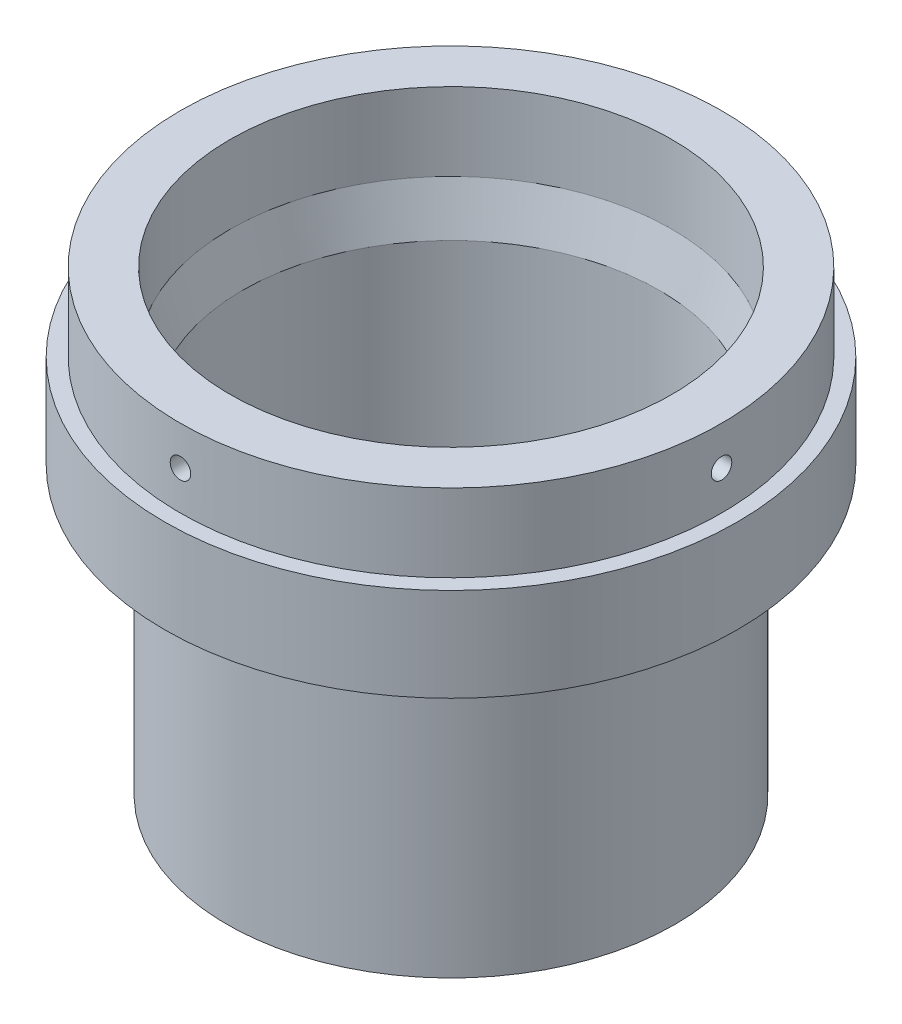
ISO-10303-21;
HEADER;
FILE_DESCRIPTION(('STEP AP214'),'2;1');
FILE_NAME('part.step','',(''),(''),'','','');
FILE_SCHEMA(('AUTOMOTIVE_DESIGN { 1 0 10303 214 1 1 1 1 }'));
ENDSEC;
DATA;
#1=APPLICATION_CONTEXT('core data for automotive mechanical design processes');
#2=APPLICATION_PROTOCOL_DEFINITION('international standard','automotive_design',2000,#1);
#3=PRODUCT_CONTEXT('',#1,'mechanical');
#4=PRODUCT('Part','Part','',(#3));
#5=PRODUCT_RELATED_PRODUCT_CATEGORY('part','',(#4));
#6=PRODUCT_DEFINITION_FORMATION('','',#4);
#7=PRODUCT_DEFINITION_CONTEXT('part definition',#1,'design');
#8=PRODUCT_DEFINITION('design','',#6,#7);
#9=PRODUCT_DEFINITION_SHAPE('','',#8);
#10=(LENGTH_UNIT() NAMED_UNIT(*) SI_UNIT(.MILLI.,.METRE.));
#11=(NAMED_UNIT(*) PLANE_ANGLE_UNIT() SI_UNIT($,.RADIAN.));
#12=(NAMED_UNIT(*) SI_UNIT($,.STERADIAN.) SOLID_ANGLE_UNIT());
#13=UNCERTAINTY_MEASURE_WITH_UNIT(LENGTH_MEASURE(1.E-05),#10,'distance_accuracy_value','');
#14=(GEOMETRIC_REPRESENTATION_CONTEXT(3) GLOBAL_UNCERTAINTY_ASSIGNED_CONTEXT((#13)) GLOBAL_UNIT_ASSIGNED_CONTEXT((#10,
#11,#12)) REPRESENTATION_CONTEXT('',''));
#15=CARTESIAN_POINT('',(0.,0.,0.));
#16=DIRECTION('',(0.,0.,1.));
#17=DIRECTION('',(1.,0.,0.));
#18=AXIS2_PLACEMENT_3D('',#15,#16,#17);
#19=CARTESIAN_POINT('',(1.3720995995543E-13,-14.9999999999998,0.));
#20=DIRECTION('',(0.,1.,0.));
#21=DIRECTION('',(-1.,0.,0.));
#22=AXIS2_PLACEMENT_3D('',#19,#20,#21);
#23=CONICAL_SURFACE('',#22,67.0000000000001,0.260602391747339);
#24=CARTESIAN_POINT('',(0.,2.32452945780892E-13,0.));
#25=DIRECTION('',(0.,1.,0.));
#26=DIRECTION('',(-1.,0.,0.));
#27=AXIS2_PLACEMENT_3D('',#24,#25,#26);
#28=CIRCLE('',#27,71.0000000000001);
#29=CARTESIAN_POINT('',(-71.,0.,0.));
#30=VERTEX_POINT('',#29);
#31=EDGE_CURVE('E114',#30,#30,#28,.T.);
#32=ORIENTED_EDGE('',*,*,#31,.T.);
#33=EDGE_LOOP('',(#32));
#34=FACE_BOUND('',#33,.T.);
#35=CARTESIAN_POINT('',(1.3720995995543E-13,-14.9999999999998,0.));
#36=DIRECTION('',(0.,1.,0.));
#37=DIRECTION('',(-1.,0.,0.));
#38=AXIS2_PLACEMENT_3D('',#35,#36,#37);
#39=CIRCLE('',#38,67.0000000000001);
#40=CARTESIAN_POINT('',(-67.,-15.,0.));
#41=VERTEX_POINT('',#40);
#42=EDGE_CURVE('E87',#41,#41,#39,.T.);
#43=ORIENTED_EDGE('',*,*,#42,.F.);
#44=EDGE_LOOP('',(#43));
#45=FACE_BOUND('',#44,.T.);
#46=ADVANCED_FACE('F41',(#34,#45),#23,.F.);
#47=CARTESIAN_POINT('',(0.,25.,0.));
#48=DIRECTION('',(0.,1.,0.));
#49=DIRECTION('',(-1.,0.,0.));
#50=AXIS2_PLACEMENT_3D('',#47,#48,#49);
#51=CYLINDRICAL_SURFACE('',#50,71.);
#52=CARTESIAN_POINT('',(0.,25.0000000000002,0.));
#53=DIRECTION('',(0.,1.,0.));
#54=DIRECTION('',(-1.,0.,0.));
#55=AXIS2_PLACEMENT_3D('',#52,#53,#54);
#56=CIRCLE('',#55,71.);
#57=CARTESIAN_POINT('',(-71.,25.,0.));
#58=VERTEX_POINT('',#57);
#59=EDGE_CURVE('E111',#58,#58,#56,.T.);
#60=ORIENTED_EDGE('',*,*,#59,.T.);
#61=EDGE_LOOP('',(#60));
#62=FACE_BOUND('',#61,.T.);
#63=ORIENTED_EDGE('',*,*,#31,.F.);
#64=EDGE_LOOP('',(#63));
#65=FACE_BOUND('',#64,.T.);
#66=ADVANCED_FACE('F172',(#62,#65),#51,.F.);
#67=CARTESIAN_POINT('',(-71.,25.,0.));
#68=DIRECTION('',(0.,1.,0.));
#69=DIRECTION('',(-1.,0.,0.));
#70=AXIS2_PLACEMENT_3D('',#67,#68,#69);
#71=PLANE('',#70);
#72=CARTESIAN_POINT('',(0.,25.0000000000003,0.));
#73=DIRECTION('',(0.,1.,0.));
#74=DIRECTION('',(-1.,0.,0.));
#75=AXIS2_PLACEMENT_3D('',#72,#73,#74);
#76=CIRCLE('',#75,87.);
#77=CARTESIAN_POINT('',(-87.,25.,0.));
#78=VERTEX_POINT('',#77);
#79=EDGE_CURVE('E108',#78,#78,#76,.T.);
#80=ORIENTED_EDGE('',*,*,#79,.T.);
#81=EDGE_LOOP('',(#80));
#82=FACE_BOUND('',#81,.T.);
#83=ORIENTED_EDGE('',*,*,#59,.F.);
#84=EDGE_LOOP('',(#83));
#85=FACE_BOUND('',#84,.T.);
#86=ADVANCED_FACE('F168',(#82,#85),#71,.T.);
#87=CARTESIAN_POINT('',(0.,25.,0.));
#88=DIRECTION('',(0.,1.,0.));
#89=DIRECTION('',(-1.,0.,0.));
#90=AXIS2_PLACEMENT_3D('',#87,#88,#89);
#91=CYLINDRICAL_SURFACE('',#90,87.);
#92=CARTESIAN_POINT('',(0.,9.20000000000024,87.));
#93=CARTESIAN_POINT('',(0.18529095244278,9.20000819478928,86.9999991587534));
#94=CARTESIAN_POINT('',(0.370714561009038,9.21565818271023,86.9994017095997));
#95=CARTESIAN_POINT('',(0.736450212431913,9.27786917070662,86.9970758018717));
#96=CARTESIAN_POINT('',(0.916755911366024,9.32446692483459,86.995345998531));
#97=CARTESIAN_POINT('',(1.26690454352066,9.44724060921909,86.9909512407089));
#98=CARTESIAN_POINT('',(1.43675261881341,9.52340186617074,86.9882867502054));
#99=CARTESIAN_POINT('',(1.76120600221916,9.70311905641533,86.9823230108704));
#100=CARTESIAN_POINT('',(1.91581497755396,9.80666837669051,86.9790239153205));
#101=CARTESIAN_POINT('',(2.20554780029224,10.0382982711597,86.9721599521716));
#102=CARTESIAN_POINT('',(2.34066081631659,10.1663923904301,86.9685949384919));
#103=CARTESIAN_POINT('',(2.58747461819329,10.4434503072389,86.9616022130806));
#104=CARTESIAN_POINT('',(2.69917446366357,10.5924149426339,86.9581745068684));
#105=CARTESIAN_POINT('',(2.89601498552485,10.9070343820858,86.9518420391884));
#106=CARTESIAN_POINT('',(2.98114812305411,11.0726939060574,86.948937426258));
#107=CARTESIAN_POINT('',(3.12238996345476,11.4159672425502,86.9439802641016));
#108=CARTESIAN_POINT('',(3.17849881763166,11.5935809927478,86.9419277104338));
#109=CARTESIAN_POINT('',(3.26007324948928,11.9556296550012,86.9389073166602));
#110=CARTESIAN_POINT('',(3.28555369069886,12.1400612136448,86.9379389504295));
#111=CARTESIAN_POINT('',(3.30519382491087,12.5105862631623,86.9371945426646));
#112=CARTESIAN_POINT('',(3.29935368404355,12.6966797452159,86.9374184948061));
#113=CARTESIAN_POINT('',(3.25653089995661,13.0651452544672,86.9390329796004));
#114=CARTESIAN_POINT('',(3.21956431173397,13.247519150564,86.9404229108407));
#115=CARTESIAN_POINT('',(3.11556283410838,13.6034708672346,86.9442117297576));
#116=CARTESIAN_POINT('',(3.04852785796583,13.7770486624324,86.9466106203448));
#117=CARTESIAN_POINT('',(2.88627407902864,14.1105326733961,86.9521476442038));
#118=CARTESIAN_POINT('',(2.79104792995578,14.2704353115656,86.95528597012));
#119=CARTESIAN_POINT('',(2.57512033053932,14.5719907710078,86.961947903449));
#120=CARTESIAN_POINT('',(2.45441878101902,14.7136435212297,86.9654715123618));
#121=CARTESIAN_POINT('',(2.19087591450724,14.9747716913061,86.9725094956572));
#122=CARTESIAN_POINT('',(2.0480206844283,15.0942330700634,86.9760238628155));
#123=CARTESIAN_POINT('',(1.74427460493382,15.3074792916116,86.9826450687882));
#124=CARTESIAN_POINT('',(1.58338375215743,15.4012641296177,86.9857519075268));
#125=CARTESIAN_POINT('',(1.24812558181971,15.5604935718993,86.9912079316731));
#126=CARTESIAN_POINT('',(1.07375804650905,15.6259377181474,86.9935571048358));
#127=CARTESIAN_POINT('',(0.716499723649196,15.7266190203942,86.997232815552));
#128=CARTESIAN_POINT('',(0.53360897297178,15.7618563070561,86.9985593575291));
#129=CARTESIAN_POINT('',(0.164617792524057,15.8011063926072,87.000039715589));
#130=CARTESIAN_POINT('',(-0.0214805680280341,15.805138618003,87.0001942612892));
#131=CARTESIAN_POINT('',(-0.391711471530855,15.7819147701557,86.9993151412912));
#132=CARTESIAN_POINT('',(-0.575844018178959,15.754658755771,86.9982814778284));
#133=CARTESIAN_POINT('',(-0.936862192099431,15.6696482048391,86.9951428804304));
#134=CARTESIAN_POINT('',(-1.11374990328072,15.6119025057017,86.9930382569186));
#135=CARTESIAN_POINT('',(-1.45532127024603,15.4675607358494,86.9879948280514));
#136=CARTESIAN_POINT('',(-1.62000488602544,15.3809645705689,86.9850560199618));
#137=CARTESIAN_POINT('',(-1.93258264558572,15.181330085297,86.9786733085207));
#138=CARTESIAN_POINT('',(-2.08046844490739,15.0682787080445,86.9752291560651));
#139=CARTESIAN_POINT('',(-2.35516879815266,14.8189620521393,86.9682246508299));
#140=CARTESIAN_POINT('',(-2.48198327094768,14.6826966841124,86.9646642976029));
#141=CARTESIAN_POINT('',(-2.71100623408401,14.3907367582438,86.9578266575501));
#142=CARTESIAN_POINT('',(-2.81320217909262,14.2350323555817,86.9545495155887));
#143=CARTESIAN_POINT('',(-2.99000138206169,13.9086642627058,86.9486500767933));
#144=CARTESIAN_POINT('',(-3.06460472179559,13.7380006168271,86.9460277780185));
#145=CARTESIAN_POINT('',(-3.18407903769409,13.3866055293846,86.9417347334941));
#146=CARTESIAN_POINT('',(-3.22895809008433,13.2058768370199,86.9400637292907));
#147=CARTESIAN_POINT('',(-3.28773632939187,12.8394431346609,86.9378609589733));
#148=CARTESIAN_POINT('',(-3.30163559349013,12.6537381370653,86.9373291900211));
#149=CARTESIAN_POINT('',(-3.29805879832098,12.2827484932855,86.9374649405143));
#150=CARTESIAN_POINT('',(-3.28060249782986,12.097463655999,86.9381317047016));
#151=CARTESIAN_POINT('',(-3.21485082014749,11.7324567766207,86.9405877702232));
#152=CARTESIAN_POINT('',(-3.16655538250463,11.552734745434,86.942377073758));
#153=CARTESIAN_POINT('',(-3.04049979189249,11.2039493913785,86.9468763781481));
#154=CARTESIAN_POINT('',(-2.96273921466861,11.0348862220225,86.9495863922602));
#155=CARTESIAN_POINT('',(-2.77996551115142,10.7122162339215,86.9556215300228));
#156=CARTESIAN_POINT('',(-2.67495331996582,10.5586088850787,86.9589466325662));
#157=CARTESIAN_POINT('',(-2.44059171131458,10.271115459261,86.9658394072512));
#158=CARTESIAN_POINT('',(-2.31122959583752,10.1372397371864,86.969407205331));
#159=CARTESIAN_POINT('',(-2.03182847359415,9.89306745491063,86.9763827597774));
#160=CARTESIAN_POINT('',(-1.88178436618135,9.78277672847471,86.9797904763855));
#161=CARTESIAN_POINT('',(-1.56520002268874,9.58887549751029,86.9860633530731));
#162=CARTESIAN_POINT('',(-1.39864747110511,9.50528511106686,86.9889281033824));
#163=CARTESIAN_POINT('',(-1.05398856671781,9.36735194852884,86.9937853389758));
#164=CARTESIAN_POINT('',(-0.875896231430999,9.31297440681631,86.9957788605621));
#165=CARTESIAN_POINT('',(-0.580570879763768,9.24937159597079,86.9981380657912));
#166=CARTESIAN_POINT('',(-0.465253454743875,9.23088065796591,86.9988332484629));
#167=CARTESIAN_POINT('',(-0.233308220571082,9.20619228272759,86.9997644803302));
#168=CARTESIAN_POINT('',(-0.116680412044109,9.1999948396222,87.0000005297452));
#169=CARTESIAN_POINT('',(0.,9.20000000000024,87.));
#170=B_SPLINE_CURVE_WITH_KNOTS('',3,(#92,#93,#94,#95,#96,#97,#98,#99,#100,#101,#102,#103,#104,
#105,#106,#107,#108,#109,#110,#111,#112,#113,#114,#115,#116,#117,#118,#119,#120,#121,#122,#123,
#124,#125,#126,#127,#128,#129,#130,#131,#132,#133,#134,#135,#136,#137,#138,#139,#140,#141,#142,
#143,#144,#145,#146,#147,#148,#149,#150,#151,#152,#153,#154,#155,#156,#157,#158,#159,#160,#161,
#162,#163,#164,#165,#166,#167,#168,#169),.UNSPECIFIED.,.T.,.F.,(4,2,2,2,2,2,2,2,2,2,2,2,2,2,2,2,
2,2,2,2,2,2,2,2,2,2,2,2,2,2,2,2,2,2,2,2,2,2,4),(0.,0.555446949206098,1.11155473833374,
1.6673868657119,2.22308490630164,2.77909049732939,3.33511841585613,3.89130397581148,
4.44748663630541,5.00339928023491,5.55930897550192,6.11493210851098,6.6705568443611,
7.22632649692753,7.78209831316598,8.33822059273788,8.89434297594115,9.45047434656434,
10.0066033115639,10.5623860342402,11.118167711396,11.6737883840563,12.2294108779418,
12.7853081859879,13.3412076342937,13.897389766457,14.4535702503061,15.0095995552982,
15.5656274750349,16.1213051354973,16.6769838852158,17.2326706361939,17.7883383219429,
18.3442965844142,18.9003922048961,19.4569058474721,20.0127557189231,20.3625289215749,
20.7123019571583),.UNSPECIFIED.);
#171=CARTESIAN_POINT('',(0.,9.20000000000024,87.));
#172=VERTEX_POINT('',#171);
#173=EDGE_CURVE('E11',#172,#172,#170,.T.);
#174=ORIENTED_EDGE('',*,*,#173,.F.);
#175=EDGE_LOOP('',(#174));
#176=FACE_BOUND('',#175,.T.);
#177=CARTESIAN_POINT('',(86.9373912652089,12.5000000000005,-3.29999999999999));
#178=CARTESIAN_POINT('',(86.9373921087452,12.6852908983684,-3.29999180516183));
#179=CARTESIAN_POINT('',(86.9379899993724,12.8707144530457,-3.28434182606637));
#180=CARTESIAN_POINT('',(86.9403174837961,13.2364499924961,-3.22213087631443));
#181=CARTESIAN_POINT('',(86.9420484231914,13.4167556333046,-3.17553315142281));
#182=CARTESIAN_POINT('',(86.9464456470428,13.766904142597,-3.05275955257967));
#183=CARTESIAN_POINT('',(86.9491114673799,13.9367521536457,-2.9765983533286));
#184=CARTESIAN_POINT('',(86.955077477937,14.2612054295914,-2.79688129892739));
#185=CARTESIAN_POINT('',(86.9583775149721,14.4158143616287,-2.69333205665157));
#186=CARTESIAN_POINT('',(86.9652425639384,14.705547234007,-2.4617022406606));
#187=CARTESIAN_POINT('',(86.9688077216945,14.8406603290756,-2.33360810447443));
#188=CARTESIAN_POINT('',(86.9757998716075,15.0874742832952,-2.05655012074578));
#189=CARTESIAN_POINT('',(86.9792268582118,15.1991742023062,-1.9075854355613));
#190=CARTESIAN_POINT('',(86.9855573366221,15.3960148004862,-1.59296595323046));
#191=CARTESIAN_POINT('',(86.988460680005,15.4811479544628,-1.42730644472432));
#192=CARTESIAN_POINT('',(86.9934153113979,15.6223898295488,-1.08403314186275));
#193=CARTESIAN_POINT('',(86.9954666038439,15.6784987017637,-0.906419409748537));
#194=CARTESIAN_POINT('',(86.9984850375646,15.7600731721785,-0.544370799839319));
#195=CARTESIAN_POINT('',(86.9994527047368,15.7855536351889,-0.359939275741994));
#196=CARTESIAN_POINT('',(87.0001965825069,15.8051938249689,0.0105857063585238));
#197=CARTESIAN_POINT('',(86.9999727994157,15.7993537176395,0.196679155553507));
#198=CARTESIAN_POINT('',(86.9983594461477,15.7565309860194,0.565144814406469));
#199=CARTESIAN_POINT('',(86.9969704757108,15.7195643829826,0.747518889028117));
#200=CARTESIAN_POINT('',(86.9931839486161,15.6155628135994,1.10347095512055));
#201=CARTESIAN_POINT('',(86.9907863890598,15.5485277608428,1.27704892131166));
#202=CARTESIAN_POINT('',(86.9852518169959,15.3862738245822,1.61053313709578));
#203=CARTESIAN_POINT('',(86.9821146122635,15.2910476128917,1.77043581790226));
#204=CARTESIAN_POINT('',(86.9754542187165,15.0751198805294,2.07199133593742));
#205=CARTESIAN_POINT('',(86.9719310283986,14.9544182606407,2.21364410208634));
#206=CARTESIAN_POINT('',(86.9648929989714,14.6908753449858,2.47477219032458));
#207=CARTESIAN_POINT('',(86.961378166521,14.548020150299,2.59423348559051));
#208=CARTESIAN_POINT('',(86.9547553468902,14.2442741710819,2.80747955566132));
#209=CARTESIAN_POINT('',(86.9516473597882,14.0833833830737,2.90126432551469));
#210=CARTESIAN_POINT('',(86.9461888573978,13.7481252286265,3.0604937190454));
#211=CARTESIAN_POINT('',(86.9438383549218,13.5737576342973,3.12593786336458));
#212=CARTESIAN_POINT('',(86.940160389997,13.2164991834045,3.22661914359559));
#213=CARTESIAN_POINT('',(86.9388329231111,13.0336083638109,3.26185641051888));
#214=CARTESIAN_POINT('',(86.9373515267722,12.6646171539529,3.30110642189102));
#215=CARTESIAN_POINT('',(86.937196866491,12.4785188349098,3.30513861164977));
#216=CARTESIAN_POINT('',(86.9380766160446,12.1082880230438,3.28191470735146));
#217=CARTESIAN_POINT('',(86.9391110236428,11.9241555265238,3.25465867214878));
#218=CARTESIAN_POINT('',(86.9422516410433,11.5631375885775,3.16964812961086));
#219=CARTESIAN_POINT('',(86.9443575395311,11.3862500582939,3.11190248065003));
#220=CARTESIAN_POINT('',(86.9494034911316,11.044679030851,2.96756087189965));
#221=CARTESIAN_POINT('',(86.9523435469871,10.8799955738203,2.88096481725154));
#222=CARTESIAN_POINT('',(86.9587281846663,10.5674179183321,2.68133049248357));
#223=CARTESIAN_POINT('',(86.9621730158476,10.4195320823178,2.56827913694813));
#224=CARTESIAN_POINT('',(86.9691780085503,10.1448316448892,2.31896250384218));
#225=CARTESIAN_POINT('',(86.9727381705149,10.0180171244476,2.18269713706913));
#226=CARTESIAN_POINT('',(86.9795746417922,9.78899406416951,1.89073718957618));
#227=CARTESIAN_POINT('',(86.98285080584,9.6867980697265,1.73503276397538));
#228=CARTESIAN_POINT('',(86.9887479303232,9.50999877989488,1.40866461259006));
#229=CARTESIAN_POINT('',(86.9913688927004,9.43539540273225,1.23800093114095));
#230=CARTESIAN_POINT('',(86.9956594914668,9.31592106076201,0.886605870882388));
#231=CARTESIAN_POINT('',(86.9973293867653,9.27104200355003,0.70587724677719));
#232=CARTESIAN_POINT('',(86.9995306542855,9.21226373144893,0.339443687907408));
#233=CARTESIAN_POINT('',(87.0000620293303,9.19836443973973,0.153738765483634));
#234=CARTESIAN_POINT('',(86.9999263793388,9.20194115686155,-0.217250930390027));
#235=CARTESIAN_POINT('',(86.9992601077487,9.21939743971789,-0.402535894619779));
#236=CARTESIAN_POINT('',(86.9968056963572,9.28514912690693,-0.767543032137184));
#237=CARTESIAN_POINT('',(86.9950175543649,9.333444591463,-0.947265194560967));
#238=CARTESIAN_POINT('',(86.9905207335537,9.45950028263822,-1.2960508028094));
#239=CARTESIAN_POINT('',(86.9878120414831,9.5372609334222,-1.46511409515387));
#240=CARTESIAN_POINT('',(86.9817791290937,9.72003482192545,-1.78778429835644));
#241=CARTESIAN_POINT('',(86.9784549298994,9.82504712440463,-1.94139173938761));
#242=CARTESIAN_POINT('',(86.971563151982,10.0594088526925,-2.22888515320914));
#243=CARTESIAN_POINT('',(86.9679954471464,10.1887709512623,-2.36276079167361));
#244=CARTESIAN_POINT('',(86.9610192240854,10.4681720056823,-2.60693291318623));
#245=CARTESIAN_POINT('',(86.9576107454089,10.618216062359,-2.71722356225437));
#246=CARTESIAN_POINT('',(86.9513358207311,10.9348003673608,-2.9111247130945));
#247=CARTESIAN_POINT('',(86.9484697844083,11.1013529402062,-2.99471508203863));
#248=CARTESIAN_POINT('',(86.9436100217506,11.4460118902259,-3.1326482059067));
#249=CARTESIAN_POINT('',(86.9416152590534,11.6241042497665,-3.1870257267278));
#250=CARTESIAN_POINT('',(86.9392545069918,11.9194295452355,-3.25062847669903));
#251=CARTESIAN_POINT('',(86.9385588423169,12.0347468855055,-3.26911938737083));
#252=CARTESIAN_POINT('',(86.937626955942,12.2666919497538,-3.29380772628162));
#253=CARTESIAN_POINT('',(86.9373907340219,12.3833196731047,-3.30000516040671));
#254=CARTESIAN_POINT('',(86.9373912652089,12.5000000000005,-3.29999999999999));
#255=B_SPLINE_CURVE_WITH_KNOTS('',3,(#177,#178,#179,#180,#181,#182,#183,#184,#185,#186,#187,
#188,#189,#190,#191,#192,#193,#194,#195,#196,#197,#198,#199,#200,#201,#202,#203,#204,#205,#206,
#207,#208,#209,#210,#211,#212,#213,#214,#215,#216,#217,#218,#219,#220,#221,#222,#223,#224,#225,
#226,#227,#228,#229,#230,#231,#232,#233,#234,#235,#236,#237,#238,#239,#240,#241,#242,#243,#244,
#245,#246,#247,#248,#249,#250,#251,#252,#253,#254),.UNSPECIFIED.,.T.,.F.,(4,2,2,2,2,2,2,2,2,2,2,
2,2,2,2,2,2,2,2,2,2,2,2,2,2,2,2,2,2,2,2,2,2,2,2,2,2,2,4),(0.,0.555446786810687,1.11155441707581,
1.66738635922061,2.2230842174279,2.77909002087966,3.33511814608765,3.89130362687079,
4.44748621202614,5.0033987573287,5.55930835803927,6.11493199889078,6.67055723649246,
7.22632703380967,7.78209899567343,8.33822106433023,8.89434324023069,9.45047482210908,
10.0066039919547,10.5623865843689,11.118168131336,11.6737882917355,12.2294102790019,
12.7853076730697,13.3412072032862,13.8973894187898,14.4535699859676,15.0095990714576,
15.5656267781686,16.121304807113,16.6769839211998,17.2326710348457,17.7883390805776,
18.3442971253285,18.9003925331219,19.4569062693984,20.0127562291731,20.3625291767923,
20.7123019569406),.UNSPECIFIED.);
#256=CARTESIAN_POINT('',(86.9373912652089,12.5000000000005,-3.29999999999999));
#257=VERTEX_POINT('',#256);
#258=EDGE_CURVE('E53',#257,#257,#255,.T.);
#259=ORIENTED_EDGE('',*,*,#258,.F.);
#260=EDGE_LOOP('',(#259));
#261=FACE_BOUND('',#260,.T.);
#262=CARTESIAN_POINT('',(0.,15.8000000000002,-87.));
#263=CARTESIAN_POINT('',(0.185290952442758,15.7999918052113,-86.9999991587534));
#264=CARTESIAN_POINT('',(0.370714561009022,15.7843418172904,-86.9994017095997));
#265=CARTESIAN_POINT('',(0.73645021243192,15.7221308292941,-86.9970758018717));
#266=CARTESIAN_POINT('',(0.916755911366049,15.6755330751662,-86.995345998531));
#267=CARTESIAN_POINT('',(1.26690454352073,15.5527593907819,-86.9909512407089));
#268=CARTESIAN_POINT('',(1.43675261881351,15.4765981338303,-86.9882867502054));
#269=CARTESIAN_POINT('',(1.76120600221933,15.2968809435858,-86.9823230108704));
#270=CARTESIAN_POINT('',(1.91581497755417,15.1933316233107,-86.9790239153205));
#271=CARTESIAN_POINT('',(2.20554780029253,14.9617017288416,-86.9721599521716));
#272=CARTESIAN_POINT('',(2.34066081631693,14.8336076095713,-86.9685949384919));
#273=CARTESIAN_POINT('',(2.58747461819373,14.5565496927625,-86.9616022130806));
#274=CARTESIAN_POINT('',(2.69917446366406,14.4075850573676,-86.9581745068684));
#275=CARTESIAN_POINT('',(2.89601498552547,14.0929656179157,-86.9518420391884));
#276=CARTESIAN_POINT('',(2.98114812305479,13.9273060939442,-86.9489374262579));
#277=CARTESIAN_POINT('',(3.12238996345557,13.5840327574514,-86.9439802641016));
#278=CARTESIAN_POINT('',(3.17849881763254,13.4064190072539,-86.9419277104338));
#279=CARTESIAN_POINT('',(3.26007324949029,13.0443703450005,-86.9389073166602));
#280=CARTESIAN_POINT('',(3.28555369069994,12.8599387863569,-86.9379389504295));
#281=CARTESIAN_POINT('',(3.30519382491209,12.4894137368394,-86.9371945426645));
#282=CARTESIAN_POINT('',(3.29935368404484,12.3033202547858,-86.9374184948061));
#283=CARTESIAN_POINT('',(3.25653089995803,11.9348547455345,-86.9390329796004));
#284=CARTESIAN_POINT('',(3.21956431173546,11.7524808494377,-86.9404229108406));
#285=CARTESIAN_POINT('',(3.11556283411001,11.396529132767,-86.9442117297575));
#286=CARTESIAN_POINT('',(3.04852785796752,11.2229513375692,-86.9466106203448));
#287=CARTESIAN_POINT('',(2.88627407903046,10.8894673266055,-86.9521476442038));
#288=CARTESIAN_POINT('',(2.79104792995766,10.729564688436,-86.9552859701199));
#289=CARTESIAN_POINT('',(2.57512033054131,10.4280092289936,-86.961947903449));
#290=CARTESIAN_POINT('',(2.45441878102106,10.2863564787717,-86.9654715123617));
#291=CARTESIAN_POINT('',(2.19087591450938,10.0252283086952,-86.9725094956571));
#292=CARTESIAN_POINT('',(2.04802068443048,9.90576692993783,-86.9760238628154));
#293=CARTESIAN_POINT('',(1.74427460493609,9.69252070838955,-86.9826450687882));
#294=CARTESIAN_POINT('',(1.58338375215974,9.59873587038332,-86.9857519075267));
#295=CARTESIAN_POINT('',(1.24812558182208,9.43950642810166,-86.9912079316731));
#296=CARTESIAN_POINT('',(1.07375804651144,9.37406228185348,-86.9935571048357));
#297=CARTESIAN_POINT('',(0.716499723651622,9.27338097960657,-86.997232815552));
#298=CARTESIAN_POINT('',(0.533608972974218,9.23814369294453,-86.9985593575291));
#299=CARTESIAN_POINT('',(0.16461779252651,9.19889360739338,-87.000039715589));
#300=CARTESIAN_POINT('',(-0.0214805680255803,9.19486138199743,-87.0001942612892));
#301=CARTESIAN_POINT('',(-0.39171147152841,9.21808522984465,-86.9993151412912));
#302=CARTESIAN_POINT('',(-0.575844018176525,9.2453412442293,-86.9982814778284));
#303=CARTESIAN_POINT('',(-0.936862192097029,9.33035179516105,-86.9951428804304));
#304=CARTESIAN_POINT('',(-1.11374990327834,9.38809749429838,-86.9930382569186));
#305=CARTESIAN_POINT('',(-1.4553212702437,9.53243926415048,-86.9879948280514));
#306=CARTESIAN_POINT('',(-1.62000488602314,9.619035429431,-86.9850560199618));
#307=CARTESIAN_POINT('',(-1.9325826455835,9.81866991470279,-86.9786733085208));
#308=CARTESIAN_POINT('',(-2.08046844490521,9.93172129195519,-86.9752291560651));
#309=CARTESIAN_POINT('',(-2.35516879815058,10.1810379478603,-86.9682246508299));
#310=CARTESIAN_POINT('',(-2.48198327094565,10.3173033158872,-86.964664297603));
#311=CARTESIAN_POINT('',(-2.71100623408208,10.6092632417556,-86.9578266575501));
#312=CARTESIAN_POINT('',(-2.81320217909075,10.7649676444177,-86.9545495155887));
#313=CARTESIAN_POINT('',(-2.99000138205995,11.0913357372935,-86.9486500767933));
#314=CARTESIAN_POINT('',(-3.06460472179391,11.2619993831722,-86.9460277780186));
#315=CARTESIAN_POINT('',(-3.18407903769255,11.6133944706147,-86.9417347334942));
#316=CARTESIAN_POINT('',(-3.22895809008285,11.7941231629793,-86.9400637292907));
#317=CARTESIAN_POINT('',(-3.28773632939053,12.1605568653383,-86.9378609589733));
#318=CARTESIAN_POINT('',(-3.30163559348885,12.3462618629339,-86.9373291900212));
#319=CARTESIAN_POINT('',(-3.29805879831984,12.7172515067137,-86.9374649405144));
#320=CARTESIAN_POINT('',(-3.28060249782879,12.9025363440002,-86.9381317047016));
#321=CARTESIAN_POINT('',(-3.21485082014657,13.2675432233785,-86.9405877702233));
#322=CARTESIAN_POINT('',(-3.16655538250377,13.4472652545653,-86.9423770737581));
#323=CARTESIAN_POINT('',(-3.04049979189177,13.7960506086208,-86.9468763781481));
#324=CARTESIAN_POINT('',(-2.96273921466794,13.9651137779768,-86.9495863922602));
#325=CARTESIAN_POINT('',(-2.77996551115087,14.287783766078,-86.9556215300229));
#326=CARTESIAN_POINT('',(-2.67495331996533,14.4413911149208,-86.9589466325663));
#327=CARTESIAN_POINT('',(-2.4405917113142,14.7288845407386,-86.9658394072512));
#328=CARTESIAN_POINT('',(-2.31122959583719,14.8627602628132,-86.969407205331));
#329=CARTESIAN_POINT('',(-2.03182847359391,15.1069325450891,-86.9763827597774));
#330=CARTESIAN_POINT('',(-1.88178436618115,15.2172232715251,-86.9797904763855));
#331=CARTESIAN_POINT('',(-1.56520002268862,15.4111245024896,-86.9860633530731));
#332=CARTESIAN_POINT('',(-1.39864747110501,15.4947148889331,-86.9889281033824));
#333=CARTESIAN_POINT('',(-1.05398856671777,15.6326480514712,-86.9937853389758));
#334=CARTESIAN_POINT('',(-0.875896231430976,15.6870255931838,-86.9957788605621));
#335=CARTESIAN_POINT('',(-0.580570879763771,15.7506284040295,-86.9981380657912));
#336=CARTESIAN_POINT('',(-0.465253454743886,15.7691193420344,-86.9988332484629));
#337=CARTESIAN_POINT('',(-0.233308220571102,15.7938077172728,-86.9997644803302));
#338=CARTESIAN_POINT('',(-0.116680412044132,15.8000051603782,-87.0000005297452));
#339=CARTESIAN_POINT('',(0.,15.8000000000002,-87.));
#340=B_SPLINE_CURVE_WITH_KNOTS('',3,(#262,#263,#264,#265,#266,#267,#268,#269,#270,#271,#272,
#273,#274,#275,#276,#277,#278,#279,#280,#281,#282,#283,#284,#285,#286,#287,#288,#289,#290,#291,
#292,#293,#294,#295,#296,#297,#298,#299,#300,#301,#302,#303,#304,#305,#306,#307,#308,#309,#310,
#311,#312,#313,#314,#315,#316,#317,#318,#319,#320,#321,#322,#323,#324,#325,#326,#327,#328,#329,
#330,#331,#332,#333,#334,#335,#336,#337,#338,#339),.UNSPECIFIED.,.T.,.F.,(4,2,2,2,2,2,2,2,2,2,2,
2,2,2,2,2,2,2,2,2,2,2,2,2,2,2,2,2,2,2,2,2,2,2,2,2,2,2,4),(0.,0.555446949206099,1.11155473833374,
1.6673868657119,2.22308490630164,2.77909049732939,3.33511841585613,3.89130397581148,
4.44748663630541,5.00339928023492,5.55930897550192,6.11493210851098,6.67055684436109,
7.22632649692753,7.78209831316598,8.33822059273788,8.89434297594115,9.45047434656434,
10.0066033115639,10.5623860342402,11.118167711396,11.6737883840563,12.2294108779418,
12.7853081859879,13.3412076342937,13.897389766457,14.4535702503061,15.0095995552982,
15.5656274750349,16.1213051354973,16.6769838852158,17.2326706361939,17.7883383219429,
18.3442965844142,18.9003922048961,19.4569058474721,20.0127557189232,20.3625289215749,
20.7123019571583),.UNSPECIFIED.);
#341=CARTESIAN_POINT('',(0.,15.8000000000002,-87.));
#342=VERTEX_POINT('',#341);
#343=EDGE_CURVE('E124',#342,#342,#340,.T.);
#344=ORIENTED_EDGE('',*,*,#343,.F.);
#345=EDGE_LOOP('',(#344));
#346=FACE_BOUND('',#345,.T.);
#347=CARTESIAN_POINT('',(-87.,9.19999999999994,0.));
#348=CARTESIAN_POINT('',(-86.9999991587534,9.20000819478892,0.185290952442726));
#349=CARTESIAN_POINT('',(-86.9994017095996,9.21565818270982,0.370714561008988));
#350=CARTESIAN_POINT('',(-86.9970758018716,9.27786917070609,0.736450212431882));
#351=CARTESIAN_POINT('',(-86.9953459985309,9.32446692483401,0.916755911366008));
#352=CARTESIAN_POINT('',(-86.9909512407088,9.4472406092184,1.26690454352068));
#353=CARTESIAN_POINT('',(-86.9882867502053,9.52340186617,1.43675261881345));
#354=CARTESIAN_POINT('',(-86.9823230108703,9.70311905641449,1.76120600221926));
#355=CARTESIAN_POINT('',(-86.9790239153205,9.80666837668962,1.91581497755409));
#356=CARTESIAN_POINT('',(-86.9721599521716,10.0382982711587,2.20554780029244));
#357=CARTESIAN_POINT('',(-86.9685949384918,10.166392390429,2.34066081631684));
#358=CARTESIAN_POINT('',(-86.9616022130805,10.4434503072378,2.58747461819362));
#359=CARTESIAN_POINT('',(-86.9581745068683,10.5924149426327,2.69917446366394));
#360=CARTESIAN_POINT('',(-86.9518420391883,10.9070343820846,2.89601498552532));
#361=CARTESIAN_POINT('',(-86.9489374262579,11.0726939060562,2.98114812305463));
#362=CARTESIAN_POINT('',(-86.9439802641015,11.415967242549,3.12238996345538));
#363=CARTESIAN_POINT('',(-86.9419277104337,11.5935809927465,3.17849881763234));
#364=CARTESIAN_POINT('',(-86.9389073166601,11.9556296549999,3.26007324949006));
#365=CARTESIAN_POINT('',(-86.9379389504294,12.1400612136435,3.28555369069971));
#366=CARTESIAN_POINT('',(-86.9371945426645,12.510586263161,3.30519382491182));
#367=CARTESIAN_POINT('',(-86.937418494806,12.6966797452146,3.29935368404457));
#368=CARTESIAN_POINT('',(-86.9390329796003,13.0651452544659,3.25653089995773));
#369=CARTESIAN_POINT('',(-86.9404229108406,13.2475191505627,3.21956431173515));
#370=CARTESIAN_POINT('',(-86.9442117297575,13.6034708672334,3.11556283410968));
#371=CARTESIAN_POINT('',(-86.9466106203447,13.7770486624312,3.04852785796717));
#372=CARTESIAN_POINT('',(-86.9521476442038,14.1105326733949,2.88627407903009));
#373=CARTESIAN_POINT('',(-86.9552859701199,14.2704353115644,2.79104792995728));
#374=CARTESIAN_POINT('',(-86.9619479034489,14.5719907710068,2.57512033054091));
#375=CARTESIAN_POINT('',(-86.9654715123617,14.7136435212287,2.45441878102065));
#376=CARTESIAN_POINT('',(-86.9725094956571,14.9747716913052,2.19087591450895));
#377=CARTESIAN_POINT('',(-86.9760238628154,15.0942330700625,2.04802068443004));
#378=CARTESIAN_POINT('',(-86.9826450687882,15.3074792916107,1.74427460493564));
#379=CARTESIAN_POINT('',(-86.9857519075267,15.401264129617,1.58338375215927));
#380=CARTESIAN_POINT('',(-86.9912079316731,15.5604935718986,1.2481255818216));
#381=CARTESIAN_POINT('',(-86.9935571048357,15.6259377181468,1.07375804651096));
#382=CARTESIAN_POINT('',(-86.997232815552,15.7266190203937,0.716499723651139));
#383=CARTESIAN_POINT('',(-86.9985593575291,15.7618563070557,0.533608972973732));
#384=CARTESIAN_POINT('',(-87.000039715589,15.8011063926068,0.164617792526021));
#385=CARTESIAN_POINT('',(-87.0001942612891,15.8051386180027,-0.0214805680260699));
#386=CARTESIAN_POINT('',(-86.9993151412912,15.7819147701555,-0.391711471528899));
#387=CARTESIAN_POINT('',(-86.9982814778284,15.7546587557708,-0.575844018177011));
#388=CARTESIAN_POINT('',(-86.9951428804304,15.6696482048391,-0.936862192097509));
#389=CARTESIAN_POINT('',(-86.9930382569186,15.6119025057017,-1.11374990327881));
#390=CARTESIAN_POINT('',(-86.9879948280514,15.4675607358496,-1.45532127024417));
#391=CARTESIAN_POINT('',(-86.9850560199618,15.3809645705691,-1.6200048860236));
#392=CARTESIAN_POINT('',(-86.9786733085207,15.1813300852972,-1.93258264558394));
#393=CARTESIAN_POINT('',(-86.9752291560651,15.0682787080448,-2.08046844490565));
#394=CARTESIAN_POINT('',(-86.9682246508299,14.8189620521397,-2.355168798151));
#395=CARTESIAN_POINT('',(-86.9646642976029,14.6826966841128,-2.48198327094606));
#396=CARTESIAN_POINT('',(-86.9578266575501,14.3907367582443,-2.71100623408248));
#397=CARTESIAN_POINT('',(-86.9545495155887,14.2350323555822,-2.81320217909113));
#398=CARTESIAN_POINT('',(-86.9486500767933,13.9086642627064,-2.99000138206031));
#399=CARTESIAN_POINT('',(-86.9460277780185,13.7380006168278,-3.06460472179426));
#400=CARTESIAN_POINT('',(-86.9417347334941,13.3866055293853,-3.18407903769287));
#401=CARTESIAN_POINT('',(-86.9400637292907,13.2058768370206,-3.22895809008316));
#402=CARTESIAN_POINT('',(-86.9378609589733,12.8394431346616,-3.28773632939081));
#403=CARTESIAN_POINT('',(-86.9373291900211,12.6537381370661,-3.30163559348913));
#404=CARTESIAN_POINT('',(-86.9374649405143,12.2827484932862,-3.29805879832009));
#405=CARTESIAN_POINT('',(-86.9381317047016,12.0974636559997,-3.28060249782903));
#406=CARTESIAN_POINT('',(-86.9405877702232,11.7324567766214,-3.21485082014678));
#407=CARTESIAN_POINT('',(-86.942377073758,11.5527347454347,-3.16655538250397));
#408=CARTESIAN_POINT('',(-86.9468763781481,11.2039493913791,-3.04049979189194));
#409=CARTESIAN_POINT('',(-86.9495863922601,11.0348862220231,-2.9627392146681));
#410=CARTESIAN_POINT('',(-86.9556215300228,10.712216233922,-2.77996551115101));
#411=CARTESIAN_POINT('',(-86.9589466325662,10.5586088850792,-2.67495331996545));
#412=CARTESIAN_POINT('',(-86.9658394072512,10.2711154592614,-2.44059171131431));
#413=CARTESIAN_POINT('',(-86.9694072053309,10.1372397371868,-2.31122959583728));
#414=CARTESIAN_POINT('',(-86.9763827597773,9.89306745491096,-2.031828473594));
#415=CARTESIAN_POINT('',(-86.9797904763854,9.78277672847499,-1.88178436618123));
#416=CARTESIAN_POINT('',(-86.9860633530731,9.58887549751047,-1.56520002268868));
#417=CARTESIAN_POINT('',(-86.9889281033824,9.50528511106699,-1.39864747110507));
#418=CARTESIAN_POINT('',(-86.9937853389758,9.36735194852887,-1.05398856671781));
#419=CARTESIAN_POINT('',(-86.995778860562,9.31297440681628,-0.87589623143102));
#420=CARTESIAN_POINT('',(-86.9981380657911,9.24937159597067,-0.580570879763809));
#421=CARTESIAN_POINT('',(-86.9988332484628,9.23088065796575,-0.465253454743923));
#422=CARTESIAN_POINT('',(-86.9997644803302,9.20619228272736,-0.233308220571136));
#423=CARTESIAN_POINT('',(-87.0000005297452,9.19999483962194,-0.116680412044165));
#424=CARTESIAN_POINT('',(-87.,9.19999999999994,0.));
#425=B_SPLINE_CURVE_WITH_KNOTS('',3,(#347,#348,#349,#350,#351,#352,#353,#354,#355,#356,#357,
#358,#359,#360,#361,#362,#363,#364,#365,#366,#367,#368,#369,#370,#371,#372,#373,#374,#375,#376,
#377,#378,#379,#380,#381,#382,#383,#384,#385,#386,#387,#388,#389,#390,#391,#392,#393,#394,#395,
#396,#397,#398,#399,#400,#401,#402,#403,#404,#405,#406,#407,#408,#409,#410,#411,#412,#413,#414,
#415,#416,#417,#418,#419,#420,#421,#422,#423,#424),.UNSPECIFIED.,.T.,.F.,(4,2,2,2,2,2,2,2,2,2,2,
2,2,2,2,2,2,2,2,2,2,2,2,2,2,2,2,2,2,2,2,2,2,2,2,2,2,2,4),(0.,0.555446949206098,1.11155473833374,
1.6673868657119,2.22308490630164,2.77909049732939,3.33511841585613,3.89130397581148,
4.44748663630542,5.00339928023492,5.55930897550193,6.11493210851098,6.67055684436109,
7.22632649692754,7.78209831316599,8.33822059273789,8.89434297594115,9.45047434656434,
10.0066033115639,10.5623860342402,11.118167711396,11.6737883840563,12.2294108779418,
12.7853081859879,13.3412076342937,13.897389766457,14.4535702503061,15.0095995552982,
15.5656274750349,16.1213051354973,16.6769838852158,17.2326706361939,17.7883383219429,
18.3442965844142,18.900392204896,19.4569058474721,20.0127557189231,20.3625289215749,
20.7123019571583),.UNSPECIFIED.);
#426=CARTESIAN_POINT('',(-87.,9.19999999999994,0.));
#427=VERTEX_POINT('',#426);
#428=EDGE_CURVE('E117',#427,#427,#425,.T.);
#429=ORIENTED_EDGE('',*,*,#428,.F.);
#430=EDGE_LOOP('',(#429));
#431=FACE_BOUND('',#430,.T.);
#432=CARTESIAN_POINT('',(0.,2.98372437868011E-13,0.));
#433=DIRECTION('',(0.,1.,0.));
#434=DIRECTION('',(-1.,0.,0.));
#435=AXIS2_PLACEMENT_3D('',#432,#433,#434);
#436=CIRCLE('',#435,87.0000000000001);
#437=CARTESIAN_POINT('',(-87.,0.,0.));
#438=VERTEX_POINT('',#437);
#439=EDGE_CURVE('E105',#438,#438,#436,.T.);
#440=ORIENTED_EDGE('',*,*,#439,.T.);
#441=EDGE_LOOP('',(#440));
#442=FACE_BOUND('',#441,.T.);
#443=ORIENTED_EDGE('',*,*,#79,.F.);
#444=EDGE_LOOP('',(#443));
#445=FACE_BOUND('',#444,.T.);
#446=ADVANCED_FACE('F129',(#176,#261,#346,#431,#442,#445),#91,.T.);
#447=CARTESIAN_POINT('',(-87.,0.,0.));
#448=DIRECTION('',(0.,1.,0.));
#449=DIRECTION('',(-1.,0.,0.));
#450=AXIS2_PLACEMENT_3D('',#447,#448,#449);
#451=PLANE('',#450);
#452=CARTESIAN_POINT('',(0.,3.15719672627779E-13,0.));
#453=DIRECTION('',(0.,1.,0.));
#454=DIRECTION('',(-1.,0.,0.));
#455=AXIS2_PLACEMENT_3D('',#452,#453,#454);
#456=CIRCLE('',#455,92.0000000000001);
#457=CARTESIAN_POINT('',(-92.,0.,0.));
#458=VERTEX_POINT('',#457);
#459=EDGE_CURVE('E102',#458,#458,#456,.T.);
#460=ORIENTED_EDGE('',*,*,#459,.T.);
#461=EDGE_LOOP('',(#460));
#462=FACE_BOUND('',#461,.T.);
#463=ORIENTED_EDGE('',*,*,#439,.F.);
#464=EDGE_LOOP('',(#463));
#465=FACE_BOUND('',#464,.T.);
#466=ADVANCED_FACE('F161',(#462,#465),#451,.T.);
#467=CARTESIAN_POINT('',(0.,25.,0.));
#468=DIRECTION('',(0.,1.,0.));
#469=DIRECTION('',(-1.,0.,0.));
#470=AXIS2_PLACEMENT_3D('',#467,#468,#469);
#471=CYLINDRICAL_SURFACE('',#470,92.0000000000001);
#472=CARTESIAN_POINT('',(1.88663694938716E-13,-29.9999999999997,0.));
#473=DIRECTION('',(0.,1.,0.));
#474=DIRECTION('',(-1.,0.,0.));
#475=AXIS2_PLACEMENT_3D('',#472,#473,#474);
#476=CIRCLE('',#475,92.0000000000002);
#477=CARTESIAN_POINT('',(-92.,-30.,0.));
#478=VERTEX_POINT('',#477);
#479=EDGE_CURVE('E99',#478,#478,#476,.T.);
#480=ORIENTED_EDGE('',*,*,#479,.T.);
#481=EDGE_LOOP('',(#480));
#482=FACE_BOUND('',#481,.T.);
#483=ORIENTED_EDGE('',*,*,#459,.F.);
#484=EDGE_LOOP('',(#483));
#485=FACE_BOUND('',#484,.T.);
#486=ADVANCED_FACE('F158',(#482,#485),#471,.T.);
#487=CARTESIAN_POINT('',(-92.,-30.,0.));
#488=DIRECTION('',(0.,-1.,0.));
#489=DIRECTION('',(1.,0.,0.));
#490=AXIS2_PLACEMENT_3D('',#487,#488,#489);
#491=PLANE('',#490);
#492=CARTESIAN_POINT('',(1.88663694938716E-13,-29.9999999999997,0.));
#493=DIRECTION('',(0.,1.,0.));
#494=DIRECTION('',(-1.,0.,0.));
#495=AXIS2_PLACEMENT_3D('',#492,#493,#494);
#496=CIRCLE('',#495,72.0000000000002);
#497=CARTESIAN_POINT('',(-72.,-30.,0.));
#498=VERTEX_POINT('',#497);
#499=EDGE_CURVE('E96',#498,#498,#496,.T.);
#500=ORIENTED_EDGE('',*,*,#499,.T.);
#501=EDGE_LOOP('',(#500));
#502=FACE_BOUND('',#501,.T.);
#503=ORIENTED_EDGE('',*,*,#479,.F.);
#504=EDGE_LOOP('',(#503));
#505=FACE_BOUND('',#504,.T.);
#506=ADVANCED_FACE('F154',(#502,#505),#491,.T.);
#507=CARTESIAN_POINT('',(0.,25.,0.));
#508=DIRECTION('',(0.,1.,0.));
#509=DIRECTION('',(-1.,0.,0.));
#510=AXIS2_PLACEMENT_3D('',#507,#508,#509);
#511=CYLINDRICAL_SURFACE('',#510,72.0000000000003);
#512=CARTESIAN_POINT('',(5.04246602836207E-13,-122.,0.));
#513=DIRECTION('',(0.,1.,0.));
#514=DIRECTION('',(-1.,0.,0.));
#515=AXIS2_PLACEMENT_3D('',#512,#513,#514);
#516=CIRCLE('',#515,72.0000000000005);
#517=CARTESIAN_POINT('',(-72.,-122.,0.));
#518=VERTEX_POINT('',#517);
#519=EDGE_CURVE('E93',#518,#518,#516,.T.);
#520=ORIENTED_EDGE('',*,*,#519,.T.);
#521=EDGE_LOOP('',(#520));
#522=FACE_BOUND('',#521,.T.);
#523=ORIENTED_EDGE('',*,*,#499,.F.);
#524=EDGE_LOOP('',(#523));
#525=FACE_BOUND('',#524,.T.);
#526=ADVANCED_FACE('F150',(#522,#525),#511,.T.);
#527=CARTESIAN_POINT('',(-72.,-122.,0.));
#528=DIRECTION('',(0.,-1.,0.));
#529=DIRECTION('',(1.,0.,0.));
#530=AXIS2_PLACEMENT_3D('',#527,#528,#529);
#531=PLANE('',#530);
#532=CARTESIAN_POINT('',(5.04246602836207E-13,-122.,0.));
#533=DIRECTION('',(0.,1.,0.));
#534=DIRECTION('',(-1.,0.,0.));
#535=AXIS2_PLACEMENT_3D('',#532,#533,#534);
#536=CIRCLE('',#535,67.0000000000005);
#537=CARTESIAN_POINT('',(-67.,-122.,0.));
#538=VERTEX_POINT('',#537);
#539=EDGE_CURVE('E90',#538,#538,#536,.T.);
#540=ORIENTED_EDGE('',*,*,#539,.T.);
#541=EDGE_LOOP('',(#540));
#542=FACE_BOUND('',#541,.T.);
#543=ORIENTED_EDGE('',*,*,#519,.F.);
#544=EDGE_LOOP('',(#543));
#545=FACE_BOUND('',#544,.T.);
#546=ADVANCED_FACE('F146',(#542,#545),#531,.T.);
#547=CARTESIAN_POINT('',(0.,25.,0.));
#548=DIRECTION('',(0.,1.,0.));
#549=DIRECTION('',(-1.,0.,0.));
#550=AXIS2_PLACEMENT_3D('',#547,#548,#549);
#551=CYLINDRICAL_SURFACE('',#550,67.0000000000003);
#552=ORIENTED_EDGE('',*,*,#42,.T.);
#553=EDGE_LOOP('',(#552));
#554=FACE_BOUND('',#553,.T.);
#555=ORIENTED_EDGE('',*,*,#539,.F.);
#556=EDGE_LOOP('',(#555));
#557=FACE_BOUND('',#556,.T.);
#558=ADVANCED_FACE('F143',(#554,#557),#551,.F.);
#559=CARTESIAN_POINT('',(-74.9828400427909,12.4999999999999,0.));
#560=DIRECTION('',(-1.,0.,0.));
#561=DIRECTION('',(0.,0.,1.));
#562=AXIS2_PLACEMENT_3D('',#559,#560,#561);
#563=CONICAL_SURFACE('',#562,3.3,1.02974425867666);
#564=CARTESIAN_POINT('',(-73.,12.4999999999999,0.));
#565=VERTEX_POINT('',#564);
#566=VERTEX_LOOP('',#565);
#567=FACE_BOUND('',#566,.T.);
#568=CARTESIAN_POINT('',(-74.9828400427909,12.4999999999999,0.));
#569=DIRECTION('',(-1.,0.,0.));
#570=DIRECTION('',(0.,0.,1.));
#571=AXIS2_PLACEMENT_3D('',#568,#569,#570);
#572=CIRCLE('',#571,3.3);
#573=CARTESIAN_POINT('',(-74.9828400427909,12.4999999999999,3.3));
#574=VERTEX_POINT('',#573);
#575=EDGE_CURVE('E84',#574,#574,#572,.T.);
#576=ORIENTED_EDGE('',*,*,#575,.T.);
#577=EDGE_LOOP('',(#576));
#578=FACE_BOUND('',#577,.T.);
#579=ADVANCED_FACE('F139',(#567,#578),#563,.F.);
#580=CARTESIAN_POINT('',(-87.,12.4999999999999,0.));
#581=DIRECTION('',(-1.,0.,0.));
#582=DIRECTION('',(0.,0.,1.));
#583=AXIS2_PLACEMENT_3D('',#580,#581,#582);
#584=CYLINDRICAL_SURFACE('',#583,3.29999999999999);
#585=ORIENTED_EDGE('',*,*,#428,.T.);
#586=EDGE_LOOP('',(#585));
#587=FACE_BOUND('',#586,.T.);
#588=ORIENTED_EDGE('',*,*,#575,.F.);
#589=EDGE_LOOP('',(#588));
#590=FACE_BOUND('',#589,.T.);
#591=ADVANCED_FACE('F133',(#587,#590),#584,.F.);
#592=CARTESIAN_POINT('',(2.60880763993279E-13,12.5000000000002,-74.9828400427909));
#593=DIRECTION('',(0.,0.,-1.));
#594=DIRECTION('',(0.,1.,0.));
#595=AXIS2_PLACEMENT_3D('',#592,#593,#594);
#596=CONICAL_SURFACE('',#595,3.3,1.02974425867665);
#597=CARTESIAN_POINT('',(2.57411317041326E-13,12.5000000000002,-73.));
#598=VERTEX_POINT('',#597);
#599=VERTEX_LOOP('',#598);
#600=FACE_BOUND('',#599,.T.);
#601=CARTESIAN_POINT('',(2.60880763993279E-13,12.5000000000002,-74.9828400427909));
#602=DIRECTION('',(0.,0.,-1.));
#603=DIRECTION('',(0.,1.,0.));
#604=AXIS2_PLACEMENT_3D('',#601,#602,#603);
#605=CIRCLE('',#604,3.3);
#606=CARTESIAN_POINT('',(2.60880763993279E-13,15.8000000000002,-74.9828400427909));
#607=VERTEX_POINT('',#606);
#608=EDGE_CURVE('E79',#607,#607,#605,.T.);
#609=ORIENTED_EDGE('',*,*,#608,.T.);
#610=EDGE_LOOP('',(#609));
#611=FACE_BOUND('',#610,.T.);
#612=ADVANCED_FACE('F138',(#600,#611),#596,.F.);
#613=CARTESIAN_POINT('',(2.60880763993279E-13,12.5000000000002,-87.));
#614=DIRECTION('',(0.,0.,-1.));
#615=DIRECTION('',(0.,1.,0.));
#616=AXIS2_PLACEMENT_3D('',#613,#614,#615);
#617=CYLINDRICAL_SURFACE('',#616,3.29999999999999);
#618=ORIENTED_EDGE('',*,*,#343,.T.);
#619=EDGE_LOOP('',(#618));
#620=FACE_BOUND('',#619,.T.);
#621=ORIENTED_EDGE('',*,*,#608,.F.);
#622=EDGE_LOOP('',(#621));
#623=FACE_BOUND('',#622,.T.);
#624=ADVANCED_FACE('F221',(#620,#623),#617,.F.);
#625=CARTESIAN_POINT('',(74.9828400427909,12.5000000000005,0.));
#626=DIRECTION('',(1.,0.,0.));
#627=DIRECTION('',(0.,0.,-1.));
#628=AXIS2_PLACEMENT_3D('',#625,#626,#627);
#629=CONICAL_SURFACE('',#628,3.3,1.02974425867666);
#630=CARTESIAN_POINT('',(72.9999999999999,12.5000000000005,0.));
#631=VERTEX_POINT('',#630);
#632=VERTEX_LOOP('',#631);
#633=FACE_BOUND('',#632,.T.);
#634=CARTESIAN_POINT('',(74.9828400427909,12.5000000000005,0.));
#635=DIRECTION('',(1.,0.,0.));
#636=DIRECTION('',(0.,0.,-1.));
#637=AXIS2_PLACEMENT_3D('',#634,#635,#636);
#638=CIRCLE('',#637,3.3);
#639=CARTESIAN_POINT('',(74.9828400427909,12.5000000000005,-3.3));
#640=VERTEX_POINT('',#639);
#641=EDGE_CURVE('E76',#640,#640,#638,.T.);
#642=ORIENTED_EDGE('',*,*,#641,.T.);
#643=EDGE_LOOP('',(#642));
#644=FACE_BOUND('',#643,.T.);
#645=ADVANCED_FACE('F230',(#633,#644),#629,.F.);
#646=CARTESIAN_POINT('',(86.9999999999999,12.5000000000005,0.));
#647=DIRECTION('',(1.,0.,0.));
#648=DIRECTION('',(0.,0.,-1.));
#649=AXIS2_PLACEMENT_3D('',#646,#647,#648);
#650=CYLINDRICAL_SURFACE('',#649,3.29999999999999);
#651=ORIENTED_EDGE('',*,*,#258,.T.);
#652=EDGE_LOOP('',(#651));
#653=FACE_BOUND('',#652,.T.);
#654=ORIENTED_EDGE('',*,*,#641,.F.);
#655=EDGE_LOOP('',(#654));
#656=FACE_BOUND('',#655,.T.);
#657=ADVANCED_FACE('F70',(#653,#656),#650,.F.);
#658=CARTESIAN_POINT('',(-9.5415474192413E-13,12.5000000000002,74.9828400427909));
#659=DIRECTION('',(0.,0.,1.));
#660=DIRECTION('',(0.,-1.,0.));
#661=AXIS2_PLACEMENT_3D('',#658,#659,#660);
#662=CONICAL_SURFACE('',#661,3.3,1.02974425867665);
#663=CARTESIAN_POINT('',(-9.57624188876084E-13,12.5000000000002,73.));
#664=VERTEX_POINT('',#663);
#665=VERTEX_LOOP('',#664);
#666=FACE_BOUND('',#665,.T.);
#667=CARTESIAN_POINT('',(-9.5415474192413E-13,12.5000000000002,74.9828400427909));
#668=DIRECTION('',(0.,0.,1.));
#669=DIRECTION('',(0.,-1.,0.));
#670=AXIS2_PLACEMENT_3D('',#667,#668,#669);
#671=CIRCLE('',#670,3.3);
#672=CARTESIAN_POINT('',(-9.5415474192413E-13,9.20000000000024,74.9828400427909));
#673=VERTEX_POINT('',#672);
#674=EDGE_CURVE('E74',#673,#673,#671,.T.);
#675=ORIENTED_EDGE('',*,*,#674,.T.);
#676=EDGE_LOOP('',(#675));
#677=FACE_BOUND('',#676,.T.);
#678=ADVANCED_FACE('F66',(#666,#677),#662,.F.);
#679=CARTESIAN_POINT('',(-9.5415474192413E-13,12.5000000000002,87.));
#680=DIRECTION('',(0.,0.,1.));
#681=DIRECTION('',(0.,-1.,0.));
#682=AXIS2_PLACEMENT_3D('',#679,#680,#681);
#683=CYLINDRICAL_SURFACE('',#682,3.29999999999999);
#684=ORIENTED_EDGE('',*,*,#173,.T.);
#685=EDGE_LOOP('',(#684));
#686=FACE_BOUND('',#685,.T.);
#687=ORIENTED_EDGE('',*,*,#674,.F.);
#688=EDGE_LOOP('',(#687));
#689=FACE_BOUND('',#688,.T.);
#690=ADVANCED_FACE('F69',(#686,#689),#683,.F.);
#691=CLOSED_SHELL('',(#46,#66,#86,#446,#466,#486,#506,#526,#546,#558,#579,#591,#612,#624,#645,
#657,#678,#690));
#692=MANIFOLD_SOLID_BREP('B2',#691);
#693=ADVANCED_BREP_SHAPE_REPRESENTATION('',(#18,#692),#14);
#694=SHAPE_DEFINITION_REPRESENTATION(#9,#693);
ENDSEC;
END-ISO-10303-21;
